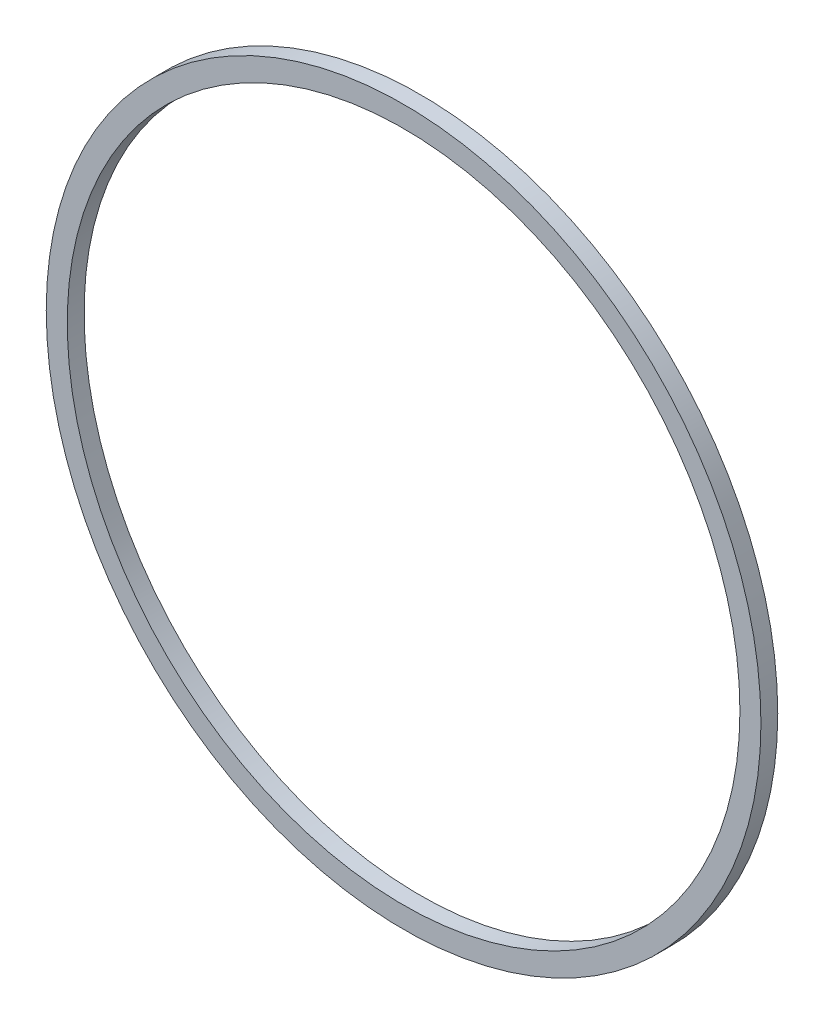
ISO-10303-21;
HEADER;
FILE_DESCRIPTION(('STEP AP214'),'2;1');
FILE_NAME('part.step','',(''),(''),'','','');
FILE_SCHEMA(('AUTOMOTIVE_DESIGN { 1 0 10303 214 1 1 1 1 }'));
ENDSEC;
DATA;
#1=APPLICATION_CONTEXT('core data for automotive mechanical design processes');
#2=APPLICATION_PROTOCOL_DEFINITION('international standard','automotive_design',2000,#1);
#3=PRODUCT_CONTEXT('',#1,'mechanical');
#4=PRODUCT('Part','Part','',(#3));
#5=PRODUCT_RELATED_PRODUCT_CATEGORY('part','',(#4));
#6=PRODUCT_DEFINITION_FORMATION('','',#4);
#7=PRODUCT_DEFINITION_CONTEXT('part definition',#1,'design');
#8=PRODUCT_DEFINITION('design','',#6,#7);
#9=PRODUCT_DEFINITION_SHAPE('','',#8);
#10=(LENGTH_UNIT() NAMED_UNIT(*) SI_UNIT(.MILLI.,.METRE.));
#11=(NAMED_UNIT(*) PLANE_ANGLE_UNIT() SI_UNIT($,.RADIAN.));
#12=(NAMED_UNIT(*) SI_UNIT($,.STERADIAN.) SOLID_ANGLE_UNIT());
#13=UNCERTAINTY_MEASURE_WITH_UNIT(LENGTH_MEASURE(1.E-05),#10,'distance_accuracy_value','');
#14=(GEOMETRIC_REPRESENTATION_CONTEXT(3) GLOBAL_UNCERTAINTY_ASSIGNED_CONTEXT((#13)) GLOBAL_UNIT_ASSIGNED_CONTEXT((#10,
#11,#12)) REPRESENTATION_CONTEXT('',''));
#15=CARTESIAN_POINT('',(0.,0.,0.));
#16=DIRECTION('',(0.,0.,1.));
#17=DIRECTION('',(1.,0.,0.));
#18=AXIS2_PLACEMENT_3D('',#15,#16,#17);
#19=CARTESIAN_POINT('',(0.,0.,2.));
#20=DIRECTION('',(0.,0.,1.));
#21=DIRECTION('',(1.,0.,0.));
#22=AXIS2_PLACEMENT_3D('',#19,#20,#21);
#23=PLANE('',#22);
#24=CARTESIAN_POINT('',(0.,0.,2.));
#25=DIRECTION('',(0.,0.,1.));
#26=DIRECTION('',(1.,0.,0.));
#27=AXIS2_PLACEMENT_3D('',#24,#25,#26);
#28=CIRCLE('',#27,42.5);
#29=CARTESIAN_POINT('',(42.5,0.,2.));
#30=VERTEX_POINT('',#29);
#31=EDGE_CURVE('E11',#30,#30,#28,.T.);
#32=ORIENTED_EDGE('',*,*,#31,.T.);
#33=EDGE_LOOP('',(#32));
#34=FACE_BOUND('',#33,.T.);
#35=CARTESIAN_POINT('',(0.,0.,2.));
#36=DIRECTION('',(0.,0.,1.));
#37=DIRECTION('',(1.,0.,0.));
#38=AXIS2_PLACEMENT_3D('',#35,#36,#37);
#39=CIRCLE('',#38,40.);
#40=CARTESIAN_POINT('',(40.,0.,2.));
#41=VERTEX_POINT('',#40);
#42=EDGE_CURVE('E49',#41,#41,#39,.T.);
#43=ORIENTED_EDGE('',*,*,#42,.F.);
#44=EDGE_LOOP('',(#43));
#45=FACE_BOUND('',#44,.T.);
#46=ADVANCED_FACE('F38',(#34,#45),#23,.T.);
#47=CARTESIAN_POINT('',(0.,0.,0.));
#48=DIRECTION('',(0.,0.,1.));
#49=DIRECTION('',(1.,0.,0.));
#50=AXIS2_PLACEMENT_3D('',#47,#48,#49);
#51=PLANE('',#50);
#52=CARTESIAN_POINT('',(0.,0.,0.));
#53=DIRECTION('',(0.,0.,1.));
#54=DIRECTION('',(1.,0.,0.));
#55=AXIS2_PLACEMENT_3D('',#52,#53,#54);
#56=CIRCLE('',#55,42.5);
#57=CARTESIAN_POINT('',(42.5,0.,0.));
#58=VERTEX_POINT('',#57);
#59=EDGE_CURVE('E42',#58,#58,#56,.T.);
#60=ORIENTED_EDGE('',*,*,#59,.F.);
#61=EDGE_LOOP('',(#60));
#62=FACE_BOUND('',#61,.T.);
#63=CARTESIAN_POINT('',(0.,0.,0.));
#64=DIRECTION('',(0.,0.,1.));
#65=DIRECTION('',(1.,0.,0.));
#66=AXIS2_PLACEMENT_3D('',#63,#64,#65);
#67=CIRCLE('',#66,40.);
#68=CARTESIAN_POINT('',(40.,0.,0.));
#69=VERTEX_POINT('',#68);
#70=EDGE_CURVE('E51',#69,#69,#67,.T.);
#71=ORIENTED_EDGE('',*,*,#70,.T.);
#72=EDGE_LOOP('',(#71));
#73=FACE_BOUND('',#72,.T.);
#74=ADVANCED_FACE('F61',(#62,#73),#51,.F.);
#75=CARTESIAN_POINT('',(0.,0.,2.));
#76=DIRECTION('',(0.,0.,-1.));
#77=DIRECTION('',(-1.,0.,0.));
#78=AXIS2_PLACEMENT_3D('',#75,#76,#77);
#79=CYLINDRICAL_SURFACE('',#78,42.5);
#80=ORIENTED_EDGE('',*,*,#31,.F.);
#81=EDGE_LOOP('',(#80));
#82=FACE_BOUND('',#81,.T.);
#83=ORIENTED_EDGE('',*,*,#59,.T.);
#84=EDGE_LOOP('',(#83));
#85=FACE_BOUND('',#84,.T.);
#86=ADVANCED_FACE('F40',(#82,#85),#79,.T.);
#87=CARTESIAN_POINT('',(0.,0.,2.));
#88=DIRECTION('',(0.,0.,-1.));
#89=DIRECTION('',(-1.,0.,0.));
#90=AXIS2_PLACEMENT_3D('',#87,#88,#89);
#91=CYLINDRICAL_SURFACE('',#90,40.);
#92=ORIENTED_EDGE('',*,*,#42,.T.);
#93=EDGE_LOOP('',(#92));
#94=FACE_BOUND('',#93,.T.);
#95=ORIENTED_EDGE('',*,*,#70,.F.);
#96=EDGE_LOOP('',(#95));
#97=FACE_BOUND('',#96,.T.);
#98=ADVANCED_FACE('F57',(#94,#97),#91,.F.);
#99=CLOSED_SHELL('',(#46,#74,#86,#98));
#100=MANIFOLD_SOLID_BREP('B2',#99);
#101=ADVANCED_BREP_SHAPE_REPRESENTATION('',(#18,#100),#14);
#102=SHAPE_DEFINITION_REPRESENTATION(#9,#101);
ENDSEC;
END-ISO-10303-21;
